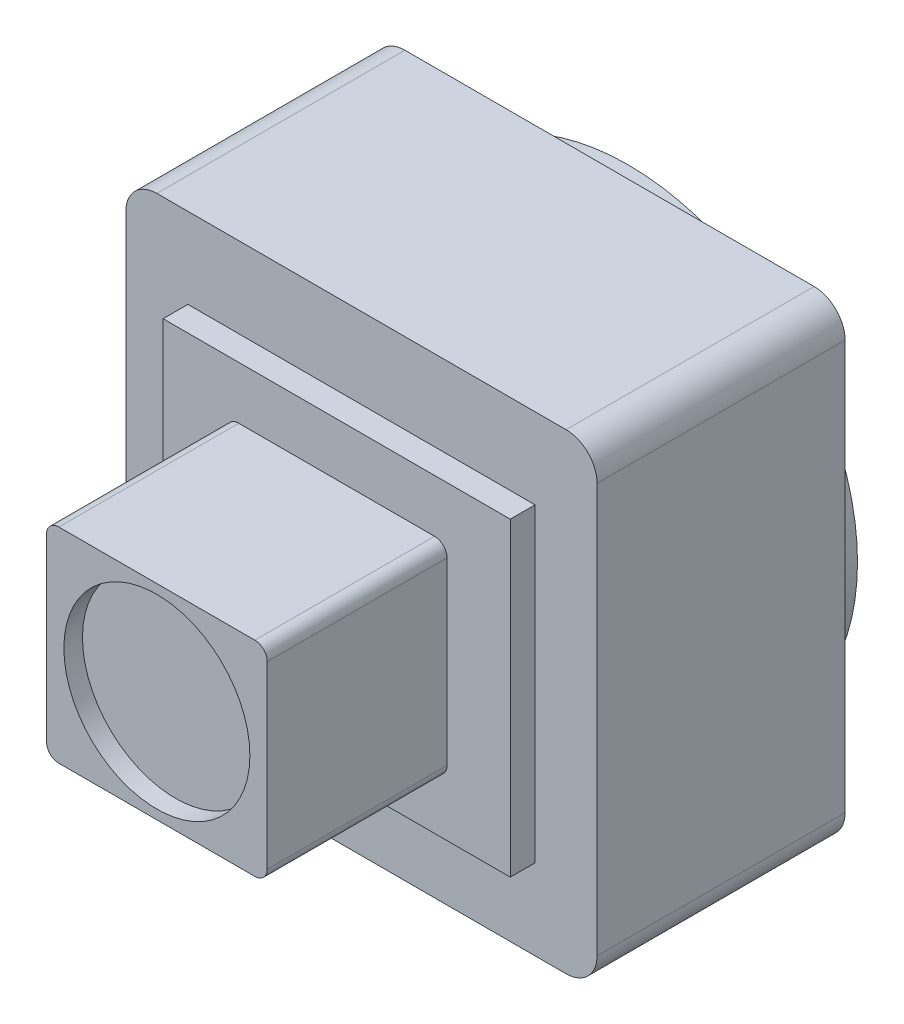
ISO-10303-21;
HEADER;
FILE_DESCRIPTION(('STEP AP214'),'2;1');
FILE_NAME('part.step','',(''),(''),'','','');
FILE_SCHEMA(('AUTOMOTIVE_DESIGN { 1 0 10303 214 1 1 1 1 }'));
ENDSEC;
DATA;
#1=APPLICATION_CONTEXT('core data for automotive mechanical design processes');
#2=APPLICATION_PROTOCOL_DEFINITION('international standard','automotive_design',2000,#1);
#3=PRODUCT_CONTEXT('',#1,'mechanical');
#4=PRODUCT('Part','Part','',(#3));
#5=PRODUCT_RELATED_PRODUCT_CATEGORY('part','',(#4));
#6=PRODUCT_DEFINITION_FORMATION('','',#4);
#7=PRODUCT_DEFINITION_CONTEXT('part definition',#1,'design');
#8=PRODUCT_DEFINITION('design','',#6,#7);
#9=PRODUCT_DEFINITION_SHAPE('','',#8);
#10=(LENGTH_UNIT() NAMED_UNIT(*) SI_UNIT(.MILLI.,.METRE.));
#11=(NAMED_UNIT(*) PLANE_ANGLE_UNIT() SI_UNIT($,.RADIAN.));
#12=(NAMED_UNIT(*) SI_UNIT($,.STERADIAN.) SOLID_ANGLE_UNIT());
#13=UNCERTAINTY_MEASURE_WITH_UNIT(LENGTH_MEASURE(1.E-05),#10,'distance_accuracy_value','');
#14=(GEOMETRIC_REPRESENTATION_CONTEXT(3) GLOBAL_UNCERTAINTY_ASSIGNED_CONTEXT((#13)) GLOBAL_UNIT_ASSIGNED_CONTEXT((#10,
#11,#12)) REPRESENTATION_CONTEXT('',''));
#15=CARTESIAN_POINT('',(0.,0.,0.));
#16=DIRECTION('',(0.,0.,1.));
#17=DIRECTION('',(1.,0.,0.));
#18=AXIS2_PLACEMENT_3D('',#15,#16,#17);
#19=CARTESIAN_POINT('',(48.26,48.26,50.8));
#20=DIRECTION('',(-1.,0.,0.));
#21=DIRECTION('',(0.,-1.,0.));
#22=AXIS2_PLACEMENT_3D('',#19,#20,#21);
#23=PLANE('',#22);
#24=DIRECTION('',(0.,1.,0.));
#25=VECTOR('',#24,1.);
#26=CARTESIAN_POINT('',(48.26,48.26,0.));
#27=LINE('',#26,#25);
#28=CARTESIAN_POINT('',(48.26,-41.91,0.));
#29=VERTEX_POINT('',#28);
#30=CARTESIAN_POINT('',(48.26,41.91,0.));
#31=VERTEX_POINT('',#30);
#32=EDGE_CURVE('E197',#29,#31,#27,.T.);
#33=ORIENTED_EDGE('',*,*,#32,.T.);
#34=DIRECTION('',(0.,0.,-1.));
#35=VECTOR('',#34,1.);
#36=CARTESIAN_POINT('',(48.26,41.91,50.8));
#37=LINE('',#36,#35);
#38=CARTESIAN_POINT('',(48.26,41.91,50.8));
#39=VERTEX_POINT('',#38);
#40=EDGE_CURVE('E276',#31,#39,#37,.F.);
#41=ORIENTED_EDGE('',*,*,#40,.T.);
#42=DIRECTION('',(0.,1.,0.));
#43=VECTOR('',#42,1.);
#44=CARTESIAN_POINT('',(48.26,48.26,50.8));
#45=LINE('',#44,#43);
#46=CARTESIAN_POINT('',(48.26,-41.91,50.8));
#47=VERTEX_POINT('',#46);
#48=EDGE_CURVE('E206',#47,#39,#45,.T.);
#49=ORIENTED_EDGE('',*,*,#48,.F.);
#50=DIRECTION('',(0.,0.,-1.));
#51=VECTOR('',#50,1.);
#52=CARTESIAN_POINT('',(48.26,-41.91,50.8));
#53=LINE('',#52,#51);
#54=EDGE_CURVE('E273',#47,#29,#53,.T.);
#55=ORIENTED_EDGE('',*,*,#54,.T.);
#56=EDGE_LOOP('',(#33,#41,#49,#55));
#57=FACE_BOUND('',#56,.T.);
#58=ADVANCED_FACE('F34',(#57),#23,.F.);
#59=CARTESIAN_POINT('',(-48.26,48.26,50.8));
#60=DIRECTION('',(0.,-1.,0.));
#61=DIRECTION('',(0.,0.,-1.));
#62=AXIS2_PLACEMENT_3D('',#59,#60,#61);
#63=PLANE('',#62);
#64=DIRECTION('',(-1.,0.,0.));
#65=VECTOR('',#64,1.);
#66=CARTESIAN_POINT('',(-48.26,48.26,50.8));
#67=LINE('',#66,#65);
#68=CARTESIAN_POINT('',(41.91,48.26,50.8));
#69=VERTEX_POINT('',#68);
#70=CARTESIAN_POINT('',(-41.91,48.26,50.8));
#71=VERTEX_POINT('',#70);
#72=EDGE_CURVE('E209',#69,#71,#67,.T.);
#73=ORIENTED_EDGE('',*,*,#72,.F.);
#74=DIRECTION('',(0.,0.,-1.));
#75=VECTOR('',#74,1.);
#76=CARTESIAN_POINT('',(41.91,48.26,50.8));
#77=LINE('',#76,#75);
#78=CARTESIAN_POINT('',(41.91,48.26,0.));
#79=VERTEX_POINT('',#78);
#80=EDGE_CURVE('E262',#69,#79,#77,.T.);
#81=ORIENTED_EDGE('',*,*,#80,.T.);
#82=DIRECTION('',(-1.,0.,0.));
#83=VECTOR('',#82,1.);
#84=CARTESIAN_POINT('',(-48.26,48.26,0.));
#85=LINE('',#84,#83);
#86=CARTESIAN_POINT('',(-41.91,48.26,0.));
#87=VERTEX_POINT('',#86);
#88=EDGE_CURVE('E200',#79,#87,#85,.T.);
#89=ORIENTED_EDGE('',*,*,#88,.T.);
#90=DIRECTION('',(0.,0.,-1.));
#91=VECTOR('',#90,1.);
#92=CARTESIAN_POINT('',(-41.91,48.26,50.8));
#93=LINE('',#92,#91);
#94=EDGE_CURVE('E260',#87,#71,#93,.F.);
#95=ORIENTED_EDGE('',*,*,#94,.T.);
#96=EDGE_LOOP('',(#73,#81,#89,#95));
#97=FACE_BOUND('',#96,.T.);
#98=ADVANCED_FACE('F320',(#97),#63,.F.);
#99=CARTESIAN_POINT('',(-48.26,48.26,50.8));
#100=DIRECTION('',(1.,0.,0.));
#101=DIRECTION('',(0.,1.,0.));
#102=AXIS2_PLACEMENT_3D('',#99,#100,#101);
#103=PLANE('',#102);
#104=DIRECTION('',(0.,-1.,0.));
#105=VECTOR('',#104,1.);
#106=CARTESIAN_POINT('',(-48.26,48.26,0.));
#107=LINE('',#106,#105);
#108=CARTESIAN_POINT('',(-48.26,41.91,0.));
#109=VERTEX_POINT('',#108);
#110=CARTESIAN_POINT('',(-48.26,-41.91,0.));
#111=VERTEX_POINT('',#110);
#112=EDGE_CURVE('E220',#109,#111,#107,.T.);
#113=ORIENTED_EDGE('',*,*,#112,.T.);
#114=DIRECTION('',(0.,0.,-1.));
#115=VECTOR('',#114,1.);
#116=CARTESIAN_POINT('',(-48.26,-41.91,50.8));
#117=LINE('',#116,#115);
#118=CARTESIAN_POINT('',(-48.26,-41.91,50.8));
#119=VERTEX_POINT('',#118);
#120=EDGE_CURVE('E11',#111,#119,#117,.F.);
#121=ORIENTED_EDGE('',*,*,#120,.T.);
#122=DIRECTION('',(0.,-1.,0.));
#123=VECTOR('',#122,1.);
#124=CARTESIAN_POINT('',(-48.26,48.26,50.8));
#125=LINE('',#124,#123);
#126=CARTESIAN_POINT('',(-48.26,41.91,50.8));
#127=VERTEX_POINT('',#126);
#128=EDGE_CURVE('E213',#127,#119,#125,.T.);
#129=ORIENTED_EDGE('',*,*,#128,.F.);
#130=DIRECTION('',(0.,0.,-1.));
#131=VECTOR('',#130,1.);
#132=CARTESIAN_POINT('',(-48.26,41.91,50.8));
#133=LINE('',#132,#131);
#134=EDGE_CURVE('E42',#127,#109,#133,.T.);
#135=ORIENTED_EDGE('',*,*,#134,.T.);
#136=EDGE_LOOP('',(#113,#121,#129,#135));
#137=FACE_BOUND('',#136,.T.);
#138=ADVANCED_FACE('F293',(#137),#103,.F.);
#139=CARTESIAN_POINT('',(-48.26,-48.26,50.8));
#140=DIRECTION('',(0.,1.,0.));
#141=DIRECTION('',(0.,0.,1.));
#142=AXIS2_PLACEMENT_3D('',#139,#140,#141);
#143=PLANE('',#142);
#144=DIRECTION('',(1.,0.,0.));
#145=VECTOR('',#144,1.);
#146=CARTESIAN_POINT('',(-48.26,-48.26,0.));
#147=LINE('',#146,#145);
#148=CARTESIAN_POINT('',(-41.91,-48.26,0.));
#149=VERTEX_POINT('',#148);
#150=CARTESIAN_POINT('',(41.91,-48.26,0.));
#151=VERTEX_POINT('',#150);
#152=EDGE_CURVE('E210',#149,#151,#147,.T.);
#153=ORIENTED_EDGE('',*,*,#152,.T.);
#154=DIRECTION('',(0.,0.,-1.));
#155=VECTOR('',#154,1.);
#156=CARTESIAN_POINT('',(41.91,-48.26,50.8));
#157=LINE('',#156,#155);
#158=CARTESIAN_POINT('',(41.91,-48.26,50.8));
#159=VERTEX_POINT('',#158);
#160=EDGE_CURVE('E49',#151,#159,#157,.F.);
#161=ORIENTED_EDGE('',*,*,#160,.T.);
#162=DIRECTION('',(1.,0.,0.));
#163=VECTOR('',#162,1.);
#164=CARTESIAN_POINT('',(-48.26,-48.26,50.8));
#165=LINE('',#164,#163);
#166=CARTESIAN_POINT('',(-41.91,-48.26,50.8));
#167=VERTEX_POINT('',#166);
#168=EDGE_CURVE('E215',#167,#159,#165,.T.);
#169=ORIENTED_EDGE('',*,*,#168,.F.);
#170=DIRECTION('',(0.,0.,-1.));
#171=VECTOR('',#170,1.);
#172=CARTESIAN_POINT('',(-41.91,-48.26,50.8));
#173=LINE('',#172,#171);
#174=EDGE_CURVE('E285',#167,#149,#173,.T.);
#175=ORIENTED_EDGE('',*,*,#174,.T.);
#176=EDGE_LOOP('',(#153,#161,#169,#175));
#177=FACE_BOUND('',#176,.T.);
#178=ADVANCED_FACE('F304',(#177),#143,.F.);
#179=CARTESIAN_POINT('',(0.,0.,50.8));
#180=DIRECTION('',(0.,0.,1.));
#181=DIRECTION('',(1.,0.,0.));
#182=AXIS2_PLACEMENT_3D('',#179,#180,#181);
#183=PLANE('',#182);
#184=DIRECTION('',(0.,1.,0.));
#185=VECTOR('',#184,1.);
#186=CARTESIAN_POINT('',(35.56,31.75,50.8));
#187=LINE('',#186,#185);
#188=CARTESIAN_POINT('',(35.56,-31.75,50.8));
#189=VERTEX_POINT('',#188);
#190=CARTESIAN_POINT('',(35.56,31.75,50.8));
#191=VERTEX_POINT('',#190);
#192=EDGE_CURVE('E196',#189,#191,#187,.T.);
#193=ORIENTED_EDGE('',*,*,#192,.F.);
#194=DIRECTION('',(1.,0.,0.));
#195=VECTOR('',#194,1.);
#196=CARTESIAN_POINT('',(-35.56,-31.75,50.8));
#197=LINE('',#196,#195);
#198=CARTESIAN_POINT('',(-35.56,-31.75,50.8));
#199=VERTEX_POINT('',#198);
#200=EDGE_CURVE('E193',#199,#189,#197,.T.);
#201=ORIENTED_EDGE('',*,*,#200,.F.);
#202=DIRECTION('',(0.,-1.,0.));
#203=VECTOR('',#202,1.);
#204=CARTESIAN_POINT('',(-35.56,31.75,50.8));
#205=LINE('',#204,#203);
#206=CARTESIAN_POINT('',(-35.56,31.75,50.8));
#207=VERTEX_POINT('',#206);
#208=EDGE_CURVE('E585',#207,#199,#205,.T.);
#209=ORIENTED_EDGE('',*,*,#208,.F.);
#210=DIRECTION('',(-1.,0.,0.));
#211=VECTOR('',#210,1.);
#212=CARTESIAN_POINT('',(-35.56,31.75,50.8));
#213=LINE('',#212,#211);
#214=EDGE_CURVE('E579',#191,#207,#213,.T.);
#215=ORIENTED_EDGE('',*,*,#214,.F.);
#216=EDGE_LOOP('',(#193,#201,#209,#215));
#217=FACE_BOUND('',#216,.T.);
#218=ORIENTED_EDGE('',*,*,#48,.T.);
#219=CARTESIAN_POINT('',(41.91,41.91,50.8));
#220=DIRECTION('',(0.,0.,1.));
#221=DIRECTION('',(1.,0.,0.));
#222=AXIS2_PLACEMENT_3D('',#219,#220,#221);
#223=CIRCLE('',#222,6.35);
#224=EDGE_CURVE('E283',#39,#69,#223,.T.);
#225=ORIENTED_EDGE('',*,*,#224,.T.);
#226=ORIENTED_EDGE('',*,*,#72,.T.);
#227=CARTESIAN_POINT('',(-41.91,41.91,50.8));
#228=DIRECTION('',(0.,0.,1.));
#229=DIRECTION('',(1.,0.,0.));
#230=AXIS2_PLACEMENT_3D('',#227,#228,#229);
#231=CIRCLE('',#230,6.35);
#232=EDGE_CURVE('E278',#71,#127,#231,.T.);
#233=ORIENTED_EDGE('',*,*,#232,.T.);
#234=ORIENTED_EDGE('',*,*,#128,.T.);
#235=CARTESIAN_POINT('',(-41.91,-41.91,50.8));
#236=DIRECTION('',(0.,0.,1.));
#237=DIRECTION('',(1.,0.,0.));
#238=AXIS2_PLACEMENT_3D('',#235,#236,#237);
#239=CIRCLE('',#238,6.35);
#240=EDGE_CURVE('E56',#119,#167,#239,.T.);
#241=ORIENTED_EDGE('',*,*,#240,.T.);
#242=ORIENTED_EDGE('',*,*,#168,.T.);
#243=CARTESIAN_POINT('',(41.91,-41.91,50.8));
#244=DIRECTION('',(0.,0.,1.));
#245=DIRECTION('',(1.,0.,0.));
#246=AXIS2_PLACEMENT_3D('',#243,#244,#245);
#247=CIRCLE('',#246,6.35);
#248=EDGE_CURVE('E281',#159,#47,#247,.T.);
#249=ORIENTED_EDGE('',*,*,#248,.T.);
#250=EDGE_LOOP('',(#218,#225,#226,#233,#234,#241,#242,#249));
#251=FACE_BOUND('',#250,.T.);
#252=ADVANCED_FACE('F306',(#217,#251),#183,.T.);
#253=CARTESIAN_POINT('',(0.,0.,0.));
#254=DIRECTION('',(0.,0.,1.));
#255=DIRECTION('',(1.,0.,0.));
#256=AXIS2_PLACEMENT_3D('',#253,#254,#255);
#257=PLANE('',#256);
#258=CARTESIAN_POINT('',(0.,0.,0.));
#259=DIRECTION('',(0.,0.,-1.));
#260=DIRECTION('',(-1.,0.,0.));
#261=AXIS2_PLACEMENT_3D('',#258,#259,#260);
#262=CIRCLE('',#261,46.99);
#263=CARTESIAN_POINT('',(46.99,0.,0.));
#264=VERTEX_POINT('',#263);
#265=EDGE_CURVE('E216',#264,#264,#262,.T.);
#266=ORIENTED_EDGE('',*,*,#265,.F.);
#267=EDGE_LOOP('',(#266));
#268=FACE_BOUND('',#267,.T.);
#269=ORIENTED_EDGE('',*,*,#88,.F.);
#270=CARTESIAN_POINT('',(41.91,41.91,0.));
#271=DIRECTION('',(0.,0.,1.));
#272=DIRECTION('',(1.,0.,0.));
#273=AXIS2_PLACEMENT_3D('',#270,#271,#272);
#274=CIRCLE('',#273,6.35);
#275=EDGE_CURVE('E271',#79,#31,#274,.F.);
#276=ORIENTED_EDGE('',*,*,#275,.T.);
#277=ORIENTED_EDGE('',*,*,#32,.F.);
#278=CARTESIAN_POINT('',(41.91,-41.91,0.));
#279=DIRECTION('',(0.,0.,1.));
#280=DIRECTION('',(1.,0.,0.));
#281=AXIS2_PLACEMENT_3D('',#278,#279,#280);
#282=CIRCLE('',#281,6.35);
#283=EDGE_CURVE('E269',#29,#151,#282,.F.);
#284=ORIENTED_EDGE('',*,*,#283,.T.);
#285=ORIENTED_EDGE('',*,*,#152,.F.);
#286=CARTESIAN_POINT('',(-41.91,-41.91,0.));
#287=DIRECTION('',(0.,0.,1.));
#288=DIRECTION('',(1.,0.,0.));
#289=AXIS2_PLACEMENT_3D('',#286,#287,#288);
#290=CIRCLE('',#289,6.35);
#291=EDGE_CURVE('E267',#149,#111,#290,.F.);
#292=ORIENTED_EDGE('',*,*,#291,.T.);
#293=ORIENTED_EDGE('',*,*,#112,.F.);
#294=CARTESIAN_POINT('',(-41.91,41.91,0.));
#295=DIRECTION('',(0.,0.,1.));
#296=DIRECTION('',(1.,0.,0.));
#297=AXIS2_PLACEMENT_3D('',#294,#295,#296);
#298=CIRCLE('',#297,6.35);
#299=EDGE_CURVE('E265',#109,#87,#298,.F.);
#300=ORIENTED_EDGE('',*,*,#299,.T.);
#301=EDGE_LOOP('',(#269,#276,#277,#284,#285,#292,#293,#300));
#302=FACE_BOUND('',#301,.T.);
#303=ADVANCED_FACE('F299',(#268,#302),#257,.F.);
#304=CARTESIAN_POINT('',(35.56,31.75,55.88));
#305=DIRECTION('',(-1.,0.,0.));
#306=DIRECTION('',(0.,0.,1.));
#307=AXIS2_PLACEMENT_3D('',#304,#305,#306);
#308=PLANE('',#307);
#309=ORIENTED_EDGE('',*,*,#192,.T.);
#310=DIRECTION('',(0.,0.,-1.));
#311=VECTOR('',#310,1.);
#312=CARTESIAN_POINT('',(35.56,31.75,55.88));
#313=LINE('',#312,#311);
#314=CARTESIAN_POINT('',(35.56,31.75,55.88));
#315=VERTEX_POINT('',#314);
#316=EDGE_CURVE('E177',#315,#191,#313,.T.);
#317=ORIENTED_EDGE('',*,*,#316,.F.);
#318=DIRECTION('',(0.,1.,0.));
#319=VECTOR('',#318,1.);
#320=CARTESIAN_POINT('',(35.56,31.75,55.88));
#321=LINE('',#320,#319);
#322=CARTESIAN_POINT('',(35.56,-31.75,55.88));
#323=VERTEX_POINT('',#322);
#324=EDGE_CURVE('E184',#323,#315,#321,.T.);
#325=ORIENTED_EDGE('',*,*,#324,.F.);
#326=DIRECTION('',(0.,0.,-1.));
#327=VECTOR('',#326,1.);
#328=CARTESIAN_POINT('',(35.56,-31.75,55.88));
#329=LINE('',#328,#327);
#330=EDGE_CURVE('E583',#323,#189,#329,.T.);
#331=ORIENTED_EDGE('',*,*,#330,.T.);
#332=EDGE_LOOP('',(#309,#317,#325,#331));
#333=FACE_BOUND('',#332,.T.);
#334=ADVANCED_FACE('F195',(#333),#308,.F.);
#335=CARTESIAN_POINT('',(-35.56,31.75,55.88));
#336=DIRECTION('',(0.,-1.,0.));
#337=DIRECTION('',(0.,0.,-1.));
#338=AXIS2_PLACEMENT_3D('',#335,#336,#337);
#339=PLANE('',#338);
#340=ORIENTED_EDGE('',*,*,#214,.T.);
#341=DIRECTION('',(0.,0.,-1.));
#342=VECTOR('',#341,1.);
#343=CARTESIAN_POINT('',(-35.56,31.75,55.88));
#344=LINE('',#343,#342);
#345=CARTESIAN_POINT('',(-35.56,31.75,55.88));
#346=VERTEX_POINT('',#345);
#347=EDGE_CURVE('E180',#346,#207,#344,.T.);
#348=ORIENTED_EDGE('',*,*,#347,.F.);
#349=DIRECTION('',(-1.,0.,0.));
#350=VECTOR('',#349,1.);
#351=CARTESIAN_POINT('',(-35.56,31.75,55.88));
#352=LINE('',#351,#350);
#353=EDGE_CURVE('E172',#315,#346,#352,.T.);
#354=ORIENTED_EDGE('',*,*,#353,.F.);
#355=ORIENTED_EDGE('',*,*,#316,.T.);
#356=EDGE_LOOP('',(#340,#348,#354,#355));
#357=FACE_BOUND('',#356,.T.);
#358=ADVANCED_FACE('F175',(#357),#339,.F.);
#359=CARTESIAN_POINT('',(-35.56,31.75,55.88));
#360=DIRECTION('',(1.,0.,0.));
#361=DIRECTION('',(0.,1.,0.));
#362=AXIS2_PLACEMENT_3D('',#359,#360,#361);
#363=PLANE('',#362);
#364=ORIENTED_EDGE('',*,*,#208,.T.);
#365=DIRECTION('',(0.,0.,-1.));
#366=VECTOR('',#365,1.);
#367=CARTESIAN_POINT('',(-35.56,-31.75,55.88));
#368=LINE('',#367,#366);
#369=CARTESIAN_POINT('',(-35.56,-31.75,55.88));
#370=VERTEX_POINT('',#369);
#371=EDGE_CURVE('E202',#370,#199,#368,.T.);
#372=ORIENTED_EDGE('',*,*,#371,.F.);
#373=DIRECTION('',(0.,-1.,0.));
#374=VECTOR('',#373,1.);
#375=CARTESIAN_POINT('',(-35.56,31.75,55.88));
#376=LINE('',#375,#374);
#377=EDGE_CURVE('E183',#346,#370,#376,.T.);
#378=ORIENTED_EDGE('',*,*,#377,.F.);
#379=ORIENTED_EDGE('',*,*,#347,.T.);
#380=EDGE_LOOP('',(#364,#372,#378,#379));
#381=FACE_BOUND('',#380,.T.);
#382=ADVANCED_FACE('F492',(#381),#363,.F.);
#383=CARTESIAN_POINT('',(-35.56,-31.75,55.88));
#384=DIRECTION('',(0.,1.,0.));
#385=DIRECTION('',(0.,0.,1.));
#386=AXIS2_PLACEMENT_3D('',#383,#384,#385);
#387=PLANE('',#386);
#388=ORIENTED_EDGE('',*,*,#200,.T.);
#389=ORIENTED_EDGE('',*,*,#330,.F.);
#390=DIRECTION('',(1.,0.,0.));
#391=VECTOR('',#390,1.);
#392=CARTESIAN_POINT('',(-35.56,-31.75,55.88));
#393=LINE('',#392,#391);
#394=EDGE_CURVE('E189',#370,#323,#393,.T.);
#395=ORIENTED_EDGE('',*,*,#394,.F.);
#396=ORIENTED_EDGE('',*,*,#371,.T.);
#397=EDGE_LOOP('',(#388,#389,#395,#396));
#398=FACE_BOUND('',#397,.T.);
#399=ADVANCED_FACE('F484',(#398),#387,.F.);
#400=CARTESIAN_POINT('',(0.,0.,55.88));
#401=DIRECTION('',(0.,0.,1.));
#402=DIRECTION('',(1.,0.,0.));
#403=AXIS2_PLACEMENT_3D('',#400,#401,#402);
#404=PLANE('',#403);
#405=DIRECTION('',(0.,1.,0.));
#406=VECTOR('',#405,1.);
#407=CARTESIAN_POINT('',(22.606,20.955,55.88));
#408=LINE('',#407,#406);
#409=CARTESIAN_POINT('',(22.606,-18.415,55.88));
#410=VERTEX_POINT('',#409);
#411=CARTESIAN_POINT('',(22.606,18.415,55.88));
#412=VERTEX_POINT('',#411);
#413=EDGE_CURVE('E603',#410,#412,#408,.T.);
#414=ORIENTED_EDGE('',*,*,#413,.F.);
#415=CARTESIAN_POINT('',(20.066,-18.415,55.88));
#416=DIRECTION('',(0.,0.,1.));
#417=DIRECTION('',(1.,0.,0.));
#418=AXIS2_PLACEMENT_3D('',#415,#416,#417);
#419=CIRCLE('',#418,2.54);
#420=CARTESIAN_POINT('',(20.066,-20.955,55.88));
#421=VERTEX_POINT('',#420);
#422=EDGE_CURVE('E256',#410,#421,#419,.F.);
#423=ORIENTED_EDGE('',*,*,#422,.T.);
#424=DIRECTION('',(1.,0.,0.));
#425=VECTOR('',#424,1.);
#426=CARTESIAN_POINT('',(-22.606,-20.955,55.88));
#427=LINE('',#426,#425);
#428=CARTESIAN_POINT('',(-20.066,-20.955,55.88));
#429=VERTEX_POINT('',#428);
#430=EDGE_CURVE('E593',#429,#421,#427,.T.);
#431=ORIENTED_EDGE('',*,*,#430,.F.);
#432=CARTESIAN_POINT('',(-20.066,-18.415,55.88));
#433=DIRECTION('',(0.,0.,1.));
#434=DIRECTION('',(1.,0.,0.));
#435=AXIS2_PLACEMENT_3D('',#432,#433,#434);
#436=CIRCLE('',#435,2.54);
#437=CARTESIAN_POINT('',(-22.606,-18.415,55.88));
#438=VERTEX_POINT('',#437);
#439=EDGE_CURVE('E252',#429,#438,#436,.F.);
#440=ORIENTED_EDGE('',*,*,#439,.T.);
#441=DIRECTION('',(0.,-1.,0.));
#442=VECTOR('',#441,1.);
#443=CARTESIAN_POINT('',(-22.606,20.955,55.88));
#444=LINE('',#443,#442);
#445=CARTESIAN_POINT('',(-22.606,18.415,55.88));
#446=VERTEX_POINT('',#445);
#447=EDGE_CURVE('E597',#446,#438,#444,.T.);
#448=ORIENTED_EDGE('',*,*,#447,.F.);
#449=CARTESIAN_POINT('',(-20.066,18.415,55.88));
#450=DIRECTION('',(0.,0.,1.));
#451=DIRECTION('',(1.,0.,0.));
#452=AXIS2_PLACEMENT_3D('',#449,#450,#451);
#453=CIRCLE('',#452,2.54);
#454=CARTESIAN_POINT('',(-20.066,20.955,55.88));
#455=VERTEX_POINT('',#454);
#456=EDGE_CURVE('E254',#446,#455,#453,.F.);
#457=ORIENTED_EDGE('',*,*,#456,.T.);
#458=DIRECTION('',(-1.,0.,0.));
#459=VECTOR('',#458,1.);
#460=CARTESIAN_POINT('',(-22.606,20.955,55.88));
#461=LINE('',#460,#459);
#462=CARTESIAN_POINT('',(20.066,20.955,55.88));
#463=VERTEX_POINT('',#462);
#464=EDGE_CURVE('E600',#463,#455,#461,.T.);
#465=ORIENTED_EDGE('',*,*,#464,.F.);
#466=CARTESIAN_POINT('',(20.066,18.415,55.88));
#467=DIRECTION('',(0.,0.,1.));
#468=DIRECTION('',(1.,0.,0.));
#469=AXIS2_PLACEMENT_3D('',#466,#467,#468);
#470=CIRCLE('',#469,2.54);
#471=EDGE_CURVE('E258',#463,#412,#470,.F.);
#472=ORIENTED_EDGE('',*,*,#471,.T.);
#473=EDGE_LOOP('',(#414,#423,#431,#440,#448,#457,#465,#472));
#474=FACE_BOUND('',#473,.T.);
#475=ORIENTED_EDGE('',*,*,#324,.T.);
#476=ORIENTED_EDGE('',*,*,#353,.T.);
#477=ORIENTED_EDGE('',*,*,#377,.T.);
#478=ORIENTED_EDGE('',*,*,#394,.T.);
#479=EDGE_LOOP('',(#475,#476,#477,#478));
#480=FACE_BOUND('',#479,.T.);
#481=ADVANCED_FACE('F187',(#474,#480),#404,.T.);
#482=CARTESIAN_POINT('',(22.606,20.955,92.71));
#483=DIRECTION('',(-1.,0.,0.));
#484=DIRECTION('',(0.,0.,1.));
#485=AXIS2_PLACEMENT_3D('',#482,#483,#484);
#486=PLANE('',#485);
#487=DIRECTION('',(0.,1.,0.));
#488=VECTOR('',#487,1.);
#489=CARTESIAN_POINT('',(22.606,20.955,92.71));
#490=LINE('',#489,#488);
#491=CARTESIAN_POINT('',(22.606,-18.415,92.71));
#492=VERTEX_POINT('',#491);
#493=CARTESIAN_POINT('',(22.606,18.415,92.71));
#494=VERTEX_POINT('',#493);
#495=EDGE_CURVE('E596',#492,#494,#490,.T.);
#496=ORIENTED_EDGE('',*,*,#495,.F.);
#497=DIRECTION('',(0.,0.,-1.));
#498=VECTOR('',#497,1.);
#499=CARTESIAN_POINT('',(22.606,-18.415,92.71));
#500=LINE('',#499,#498);
#501=EDGE_CURVE('E249',#492,#410,#500,.T.);
#502=ORIENTED_EDGE('',*,*,#501,.T.);
#503=ORIENTED_EDGE('',*,*,#413,.T.);
#504=DIRECTION('',(0.,0.,-1.));
#505=VECTOR('',#504,1.);
#506=CARTESIAN_POINT('',(22.606,18.415,92.71));
#507=LINE('',#506,#505);
#508=EDGE_CURVE('E247',#412,#494,#507,.F.);
#509=ORIENTED_EDGE('',*,*,#508,.T.);
#510=EDGE_LOOP('',(#496,#502,#503,#509));
#511=FACE_BOUND('',#510,.T.);
#512=ADVANCED_FACE('F468',(#511),#486,.F.);
#513=CARTESIAN_POINT('',(-22.606,20.955,92.71));
#514=DIRECTION('',(0.,-1.,0.));
#515=DIRECTION('',(0.,0.,-1.));
#516=AXIS2_PLACEMENT_3D('',#513,#514,#515);
#517=PLANE('',#516);
#518=ORIENTED_EDGE('',*,*,#464,.T.);
#519=DIRECTION('',(0.,0.,-1.));
#520=VECTOR('',#519,1.);
#521=CARTESIAN_POINT('',(-20.066,20.955,92.71));
#522=LINE('',#521,#520);
#523=CARTESIAN_POINT('',(-20.066,20.955,92.71));
#524=VERTEX_POINT('',#523);
#525=EDGE_CURVE('E245',#455,#524,#522,.F.);
#526=ORIENTED_EDGE('',*,*,#525,.T.);
#527=DIRECTION('',(-1.,0.,0.));
#528=VECTOR('',#527,1.);
#529=CARTESIAN_POINT('',(-22.606,20.955,92.71));
#530=LINE('',#529,#528);
#531=CARTESIAN_POINT('',(20.066,20.955,92.71));
#532=VERTEX_POINT('',#531);
#533=EDGE_CURVE('E612',#532,#524,#530,.T.);
#534=ORIENTED_EDGE('',*,*,#533,.F.);
#535=DIRECTION('',(0.,0.,-1.));
#536=VECTOR('',#535,1.);
#537=CARTESIAN_POINT('',(20.066,20.955,92.71));
#538=LINE('',#537,#536);
#539=EDGE_CURVE('E242',#532,#463,#538,.T.);
#540=ORIENTED_EDGE('',*,*,#539,.T.);
#541=EDGE_LOOP('',(#518,#526,#534,#540));
#542=FACE_BOUND('',#541,.T.);
#543=ADVANCED_FACE('F459',(#542),#517,.F.);
#544=CARTESIAN_POINT('',(-22.606,20.955,92.71));
#545=DIRECTION('',(1.,0.,0.));
#546=DIRECTION('',(0.,1.,0.));
#547=AXIS2_PLACEMENT_3D('',#544,#545,#546);
#548=PLANE('',#547);
#549=ORIENTED_EDGE('',*,*,#447,.T.);
#550=DIRECTION('',(0.,0.,-1.));
#551=VECTOR('',#550,1.);
#552=CARTESIAN_POINT('',(-22.606,-18.415,92.71));
#553=LINE('',#552,#551);
#554=CARTESIAN_POINT('',(-22.606,-18.415,92.71));
#555=VERTEX_POINT('',#554);
#556=EDGE_CURVE('E232',#438,#555,#553,.F.);
#557=ORIENTED_EDGE('',*,*,#556,.T.);
#558=DIRECTION('',(0.,-1.,0.));
#559=VECTOR('',#558,1.);
#560=CARTESIAN_POINT('',(-22.606,20.955,92.71));
#561=LINE('',#560,#559);
#562=CARTESIAN_POINT('',(-22.606,18.415,92.71));
#563=VERTEX_POINT('',#562);
#564=EDGE_CURVE('E609',#563,#555,#561,.T.);
#565=ORIENTED_EDGE('',*,*,#564,.F.);
#566=DIRECTION('',(0.,0.,-1.));
#567=VECTOR('',#566,1.);
#568=CARTESIAN_POINT('',(-22.606,18.415,92.71));
#569=LINE('',#568,#567);
#570=EDGE_CURVE('E229',#563,#446,#569,.T.);
#571=ORIENTED_EDGE('',*,*,#570,.T.);
#572=EDGE_LOOP('',(#549,#557,#565,#571));
#573=FACE_BOUND('',#572,.T.);
#574=ADVANCED_FACE('F450',(#573),#548,.F.);
#575=CARTESIAN_POINT('',(-22.606,-20.955,92.71));
#576=DIRECTION('',(0.,1.,0.));
#577=DIRECTION('',(0.,0.,1.));
#578=AXIS2_PLACEMENT_3D('',#575,#576,#577);
#579=PLANE('',#578);
#580=DIRECTION('',(1.,0.,0.));
#581=VECTOR('',#580,1.);
#582=CARTESIAN_POINT('',(-22.606,-20.955,92.71));
#583=LINE('',#582,#581);
#584=CARTESIAN_POINT('',(-20.066,-20.955,92.71));
#585=VERTEX_POINT('',#584);
#586=CARTESIAN_POINT('',(20.066,-20.955,92.71));
#587=VERTEX_POINT('',#586);
#588=EDGE_CURVE('E580',#585,#587,#583,.T.);
#589=ORIENTED_EDGE('',*,*,#588,.F.);
#590=DIRECTION('',(0.,0.,-1.));
#591=VECTOR('',#590,1.);
#592=CARTESIAN_POINT('',(-20.066,-20.955,92.71));
#593=LINE('',#592,#591);
#594=EDGE_CURVE('E226',#585,#429,#593,.T.);
#595=ORIENTED_EDGE('',*,*,#594,.T.);
#596=ORIENTED_EDGE('',*,*,#430,.T.);
#597=DIRECTION('',(0.,0.,-1.));
#598=VECTOR('',#597,1.);
#599=CARTESIAN_POINT('',(20.066,-20.955,92.71));
#600=LINE('',#599,#598);
#601=EDGE_CURVE('E224',#421,#587,#600,.F.);
#602=ORIENTED_EDGE('',*,*,#601,.T.);
#603=EDGE_LOOP('',(#589,#595,#596,#602));
#604=FACE_BOUND('',#603,.T.);
#605=ADVANCED_FACE('F441',(#604),#579,.F.);
#606=CARTESIAN_POINT('',(0.,0.,92.71));
#607=DIRECTION('',(0.,0.,1.));
#608=DIRECTION('',(1.,0.,0.));
#609=AXIS2_PLACEMENT_3D('',#606,#607,#608);
#610=PLANE('',#609);
#611=CARTESIAN_POINT('',(0.,0.,92.71));
#612=DIRECTION('',(0.,0.,1.));
#613=DIRECTION('',(1.,0.,0.));
#614=AXIS2_PLACEMENT_3D('',#611,#612,#613);
#615=CIRCLE('',#614,19.05);
#616=CARTESIAN_POINT('',(19.05,0.,92.71));
#617=VERTEX_POINT('',#616);
#618=EDGE_CURVE('E617',#617,#617,#615,.T.);
#619=ORIENTED_EDGE('',*,*,#618,.F.);
#620=EDGE_LOOP('',(#619));
#621=FACE_BOUND('',#620,.T.);
#622=ORIENTED_EDGE('',*,*,#564,.T.);
#623=CARTESIAN_POINT('',(-20.066,-18.415,92.71));
#624=DIRECTION('',(0.,0.,1.));
#625=DIRECTION('',(1.,0.,0.));
#626=AXIS2_PLACEMENT_3D('',#623,#624,#625);
#627=CIRCLE('',#626,2.54);
#628=EDGE_CURVE('E240',#555,#585,#627,.T.);
#629=ORIENTED_EDGE('',*,*,#628,.T.);
#630=ORIENTED_EDGE('',*,*,#588,.T.);
#631=CARTESIAN_POINT('',(20.066,-18.415,92.71));
#632=DIRECTION('',(0.,0.,1.));
#633=DIRECTION('',(1.,0.,0.));
#634=AXIS2_PLACEMENT_3D('',#631,#632,#633);
#635=CIRCLE('',#634,2.54);
#636=EDGE_CURVE('E236',#587,#492,#635,.T.);
#637=ORIENTED_EDGE('',*,*,#636,.T.);
#638=ORIENTED_EDGE('',*,*,#495,.T.);
#639=CARTESIAN_POINT('',(20.066,18.415,92.71));
#640=DIRECTION('',(0.,0.,1.));
#641=DIRECTION('',(1.,0.,0.));
#642=AXIS2_PLACEMENT_3D('',#639,#640,#641);
#643=CIRCLE('',#642,2.54);
#644=EDGE_CURVE('E234',#494,#532,#643,.T.);
#645=ORIENTED_EDGE('',*,*,#644,.T.);
#646=ORIENTED_EDGE('',*,*,#533,.T.);
#647=CARTESIAN_POINT('',(-20.066,18.415,92.71));
#648=DIRECTION('',(0.,0.,1.));
#649=DIRECTION('',(1.,0.,0.));
#650=AXIS2_PLACEMENT_3D('',#647,#648,#649);
#651=CIRCLE('',#650,2.54);
#652=EDGE_CURVE('E238',#524,#563,#651,.T.);
#653=ORIENTED_EDGE('',*,*,#652,.T.);
#654=EDGE_LOOP('',(#622,#629,#630,#637,#638,#645,#646,#653));
#655=FACE_BOUND('',#654,.T.);
#656=ADVANCED_FACE('F432',(#621,#655),#610,.T.);
#657=CARTESIAN_POINT('',(0.,0.,88.9));
#658=DIRECTION('',(0.,0.,1.));
#659=DIRECTION('',(1.,0.,0.));
#660=AXIS2_PLACEMENT_3D('',#657,#658,#659);
#661=CYLINDRICAL_SURFACE('',#660,19.05);
#662=CARTESIAN_POINT('',(0.,0.,88.9));
#663=DIRECTION('',(0.,0.,1.));
#664=DIRECTION('',(1.,0.,0.));
#665=AXIS2_PLACEMENT_3D('',#662,#663,#664);
#666=CIRCLE('',#665,19.05);
#667=CARTESIAN_POINT('',(19.05,0.,88.9));
#668=VERTEX_POINT('',#667);
#669=EDGE_CURVE('E606',#668,#668,#666,.T.);
#670=CARTESIAN_POINT('',(19.05,0.,88.9));
#671=CARTESIAN_POINT('',(19.05,0.,88.9396875));
#672=CARTESIAN_POINT('',(19.05,0.,88.979375));
#673=CARTESIAN_POINT('',(19.05,0.,89.05875));
#674=CARTESIAN_POINT('',(19.05,0.,89.0984375));
#675=CARTESIAN_POINT('',(19.05,0.,89.1778125));
#676=CARTESIAN_POINT('',(19.05,0.,89.2175));
#677=CARTESIAN_POINT('',(19.05,0.,89.296875));
#678=CARTESIAN_POINT('',(19.05,0.,89.3365625));
#679=CARTESIAN_POINT('',(19.05,0.,89.4159375));
#680=CARTESIAN_POINT('',(19.05,0.,89.455625));
#681=CARTESIAN_POINT('',(19.05,0.,89.535));
#682=CARTESIAN_POINT('',(19.05,0.,89.5746875));
#683=CARTESIAN_POINT('',(19.05,0.,89.6540625));
#684=CARTESIAN_POINT('',(19.05,0.,89.69375));
#685=CARTESIAN_POINT('',(19.05,0.,89.773125));
#686=CARTESIAN_POINT('',(19.05,0.,89.8128125));
#687=CARTESIAN_POINT('',(19.05,0.,89.8921875));
#688=CARTESIAN_POINT('',(19.05,0.,89.931875));
#689=CARTESIAN_POINT('',(19.05,0.,90.01125));
#690=CARTESIAN_POINT('',(19.05,0.,90.0509375));
#691=CARTESIAN_POINT('',(19.05,0.,90.1303125));
#692=CARTESIAN_POINT('',(19.05,0.,90.17));
#693=CARTESIAN_POINT('',(19.05,0.,90.249375));
#694=CARTESIAN_POINT('',(19.05,0.,90.2890625));
#695=CARTESIAN_POINT('',(19.05,0.,90.3684375));
#696=CARTESIAN_POINT('',(19.05,0.,90.408125));
#697=CARTESIAN_POINT('',(19.05,0.,90.4875));
#698=CARTESIAN_POINT('',(19.05,0.,90.5271875));
#699=CARTESIAN_POINT('',(19.05,0.,90.6065625));
#700=CARTESIAN_POINT('',(19.05,0.,90.64625));
#701=CARTESIAN_POINT('',(19.05,0.,90.725625));
#702=CARTESIAN_POINT('',(19.05,0.,90.7653125));
#703=CARTESIAN_POINT('',(19.05,0.,90.8446875));
#704=CARTESIAN_POINT('',(19.05,0.,90.884375));
#705=CARTESIAN_POINT('',(19.05,0.,90.96375));
#706=CARTESIAN_POINT('',(19.05,0.,91.0034375));
#707=CARTESIAN_POINT('',(19.05,0.,91.0828125));
#708=CARTESIAN_POINT('',(19.05,0.,91.1225));
#709=CARTESIAN_POINT('',(19.05,0.,91.201875));
#710=CARTESIAN_POINT('',(19.05,0.,91.2415625));
#711=CARTESIAN_POINT('',(19.05,0.,91.3209375));
#712=CARTESIAN_POINT('',(19.05,0.,91.360625));
#713=CARTESIAN_POINT('',(19.05,0.,91.44));
#714=CARTESIAN_POINT('',(19.05,0.,91.4796875));
#715=CARTESIAN_POINT('',(19.05,0.,91.5590625));
#716=CARTESIAN_POINT('',(19.05,0.,91.59875));
#717=CARTESIAN_POINT('',(19.05,0.,91.678125));
#718=CARTESIAN_POINT('',(19.05,0.,91.7178125));
#719=CARTESIAN_POINT('',(19.05,0.,91.7971875));
#720=CARTESIAN_POINT('',(19.05,0.,91.836875));
#721=CARTESIAN_POINT('',(19.05,0.,91.91625));
#722=CARTESIAN_POINT('',(19.05,0.,91.9559375));
#723=CARTESIAN_POINT('',(19.05,0.,92.0353125));
#724=CARTESIAN_POINT('',(19.05,0.,92.075));
#725=CARTESIAN_POINT('',(19.05,0.,92.154375));
#726=CARTESIAN_POINT('',(19.05,0.,92.1940625));
#727=CARTESIAN_POINT('',(19.05,0.,92.2734375));
#728=CARTESIAN_POINT('',(19.05,0.,92.313125));
#729=CARTESIAN_POINT('',(19.05,0.,92.3925));
#730=CARTESIAN_POINT('',(19.05,0.,92.4321875));
#731=CARTESIAN_POINT('',(19.05,0.,92.5115625));
#732=CARTESIAN_POINT('',(19.05,0.,92.55125));
#733=CARTESIAN_POINT('',(19.05,0.,92.630625));
#734=CARTESIAN_POINT('',(19.05,0.,92.6703125));
#735=CARTESIAN_POINT('',(19.05,0.,92.71));
#736=B_SPLINE_CURVE_WITH_KNOTS('',3,(#670,#671,#672,#673,#674,#675,#676,#677,#678,#679,#680,
#681,#682,#683,#684,#685,#686,#687,#688,#689,#690,#691,#692,#693,#694,#695,#696,#697,#698,#699,
#700,#701,#702,#703,#704,#705,#706,#707,#708,#709,#710,#711,#712,#713,#714,#715,#716,#717,#718,
#719,#720,#721,#722,#723,#724,#725,#726,#727,#728,#729,#730,#731,#732,#733,#734,#735),
.UNSPECIFIED.,.F.,.F.,(4,2,2,2,2,2,2,2,2,2,2,2,2,2,2,2,2,2,2,2,2,2,2,2,2,2,2,2,2,2,2,2,4),(0.,
0.119062499999989,0.238124999999992,0.357187499999995,0.476249999999998,0.595312499999986,
0.714374999999989,0.833437499999992,0.952499999999995,1.0715625,1.19062499999999,
1.30968749999999,1.42874999999999,1.5478125,1.66687499999998,1.78593749999999,1.90499999999999,
2.02406249999999,2.143125,2.26218749999998,2.38124999999999,2.50031249999999,2.61937499999999,
2.73843749999998,2.85749999999998,2.97656249999999,3.09562499999999,3.21468749999999,
3.33374999999998,3.45281249999999,3.57187499999999,3.69093749999999,3.80999999999998),.UNSPECIFIED.);
#737=EDGE_CURVE('BSEAM423',#668,#617,#736,.T.);
#738=ORIENTED_EDGE('',*,*,#669,.F.);
#739=ORIENTED_EDGE('',*,*,#618,.T.);
#740=ORIENTED_EDGE('',*,*,#737,.T.);
#741=ORIENTED_EDGE('',*,*,#737,.F.);
#742=EDGE_LOOP('',(#738,#740,#739,#741));
#743=FACE_BOUND('',#742,.T.);
#744=ADVANCED_FACE('F423',(#743),#661,.F.);
#745=CARTESIAN_POINT('',(0.,0.,88.9));
#746=DIRECTION('',(0.,0.,1.));
#747=DIRECTION('',(1.,0.,0.));
#748=AXIS2_PLACEMENT_3D('',#745,#746,#747);
#749=PLANE('',#748);
#750=ORIENTED_EDGE('',*,*,#669,.T.);
#751=EDGE_LOOP('',(#750));
#752=FACE_BOUND('',#751,.T.);
#753=ADVANCED_FACE('F414',(#752),#749,.T.);
#754=CARTESIAN_POINT('',(0.,0.,-3.81));
#755=DIRECTION('',(0.,0.,1.));
#756=DIRECTION('',(1.,0.,0.));
#757=AXIS2_PLACEMENT_3D('',#754,#755,#756);
#758=CYLINDRICAL_SURFACE('',#757,46.99);
#759=CARTESIAN_POINT('',(0.,0.,-3.81));
#760=DIRECTION('',(0.,0.,-1.));
#761=DIRECTION('',(-1.,0.,0.));
#762=AXIS2_PLACEMENT_3D('',#759,#760,#761);
#763=CIRCLE('',#762,46.99);
#764=CARTESIAN_POINT('',(46.99,0.,-3.81));
#765=VERTEX_POINT('',#764);
#766=EDGE_CURVE('E620',#765,#765,#763,.T.);
#767=CARTESIAN_POINT('',(46.99,0.,-3.81));
#768=CARTESIAN_POINT('',(46.99,0.,-3.7703125));
#769=CARTESIAN_POINT('',(46.99,0.,-3.730625));
#770=CARTESIAN_POINT('',(46.99,0.,-3.65125));
#771=CARTESIAN_POINT('',(46.99,0.,-3.6115625));
#772=CARTESIAN_POINT('',(46.99,0.,-3.5321875));
#773=CARTESIAN_POINT('',(46.99,0.,-3.4925));
#774=CARTESIAN_POINT('',(46.99,0.,-3.413125));
#775=CARTESIAN_POINT('',(46.99,0.,-3.3734375));
#776=CARTESIAN_POINT('',(46.99,0.,-3.2940625));
#777=CARTESIAN_POINT('',(46.99,0.,-3.254375));
#778=CARTESIAN_POINT('',(46.99,0.,-3.175));
#779=CARTESIAN_POINT('',(46.99,0.,-3.1353125));
#780=CARTESIAN_POINT('',(46.99,0.,-3.0559375));
#781=CARTESIAN_POINT('',(46.99,0.,-3.01625));
#782=CARTESIAN_POINT('',(46.99,0.,-2.936875));
#783=CARTESIAN_POINT('',(46.99,0.,-2.8971875));
#784=CARTESIAN_POINT('',(46.99,0.,-2.8178125));
#785=CARTESIAN_POINT('',(46.99,0.,-2.778125));
#786=CARTESIAN_POINT('',(46.99,0.,-2.69875));
#787=CARTESIAN_POINT('',(46.99,0.,-2.6590625));
#788=CARTESIAN_POINT('',(46.99,0.,-2.5796875));
#789=CARTESIAN_POINT('',(46.99,0.,-2.54));
#790=CARTESIAN_POINT('',(46.99,0.,-2.460625));
#791=CARTESIAN_POINT('',(46.99,0.,-2.4209375));
#792=CARTESIAN_POINT('',(46.99,0.,-2.3415625));
#793=CARTESIAN_POINT('',(46.99,0.,-2.301875));
#794=CARTESIAN_POINT('',(46.99,0.,-2.2225));
#795=CARTESIAN_POINT('',(46.99,0.,-2.1828125));
#796=CARTESIAN_POINT('',(46.99,0.,-2.1034375));
#797=CARTESIAN_POINT('',(46.99,0.,-2.06375));
#798=CARTESIAN_POINT('',(46.99,0.,-1.984375));
#799=CARTESIAN_POINT('',(46.99,0.,-1.9446875));
#800=CARTESIAN_POINT('',(46.99,0.,-1.8653125));
#801=CARTESIAN_POINT('',(46.99,0.,-1.825625));
#802=CARTESIAN_POINT('',(46.99,0.,-1.74625));
#803=CARTESIAN_POINT('',(46.99,0.,-1.7065625));
#804=CARTESIAN_POINT('',(46.99,0.,-1.6271875));
#805=CARTESIAN_POINT('',(46.99,0.,-1.5875));
#806=CARTESIAN_POINT('',(46.99,0.,-1.508125));
#807=CARTESIAN_POINT('',(46.99,0.,-1.4684375));
#808=CARTESIAN_POINT('',(46.99,0.,-1.3890625));
#809=CARTESIAN_POINT('',(46.99,0.,-1.349375));
#810=CARTESIAN_POINT('',(46.99,0.,-1.27));
#811=CARTESIAN_POINT('',(46.99,0.,-1.2303125));
#812=CARTESIAN_POINT('',(46.99,0.,-1.1509375));
#813=CARTESIAN_POINT('',(46.99,0.,-1.11125));
#814=CARTESIAN_POINT('',(46.99,0.,-1.031875));
#815=CARTESIAN_POINT('',(46.99,0.,-0.9921875));
#816=CARTESIAN_POINT('',(46.99,0.,-0.9128125));
#817=CARTESIAN_POINT('',(46.99,0.,-0.873125));
#818=CARTESIAN_POINT('',(46.99,0.,-0.79375));
#819=CARTESIAN_POINT('',(46.99,0.,-0.7540625));
#820=CARTESIAN_POINT('',(46.99,0.,-0.6746875));
#821=CARTESIAN_POINT('',(46.99,0.,-0.635));
#822=CARTESIAN_POINT('',(46.99,0.,-0.555625));
#823=CARTESIAN_POINT('',(46.99,0.,-0.5159375));
#824=CARTESIAN_POINT('',(46.99,0.,-0.4365625));
#825=CARTESIAN_POINT('',(46.99,0.,-0.396875));
#826=CARTESIAN_POINT('',(46.99,0.,-0.3175));
#827=CARTESIAN_POINT('',(46.99,0.,-0.2778125));
#828=CARTESIAN_POINT('',(46.99,0.,-0.1984375));
#829=CARTESIAN_POINT('',(46.99,0.,-0.15875));
#830=CARTESIAN_POINT('',(46.99,0.,-0.0793749999999999));
#831=CARTESIAN_POINT('',(46.99,0.,-0.0396874999999999));
#832=CARTESIAN_POINT('',(46.99,0.,0.));
#833=B_SPLINE_CURVE_WITH_KNOTS('',3,(#767,#768,#769,#770,#771,#772,#773,#774,#775,#776,#777,
#778,#779,#780,#781,#782,#783,#784,#785,#786,#787,#788,#789,#790,#791,#792,#793,#794,#795,#796,
#797,#798,#799,#800,#801,#802,#803,#804,#805,#806,#807,#808,#809,#810,#811,#812,#813,#814,#815,
#816,#817,#818,#819,#820,#821,#822,#823,#824,#825,#826,#827,#828,#829,#830,#831,#832),
.UNSPECIFIED.,.F.,.F.,(4,2,2,2,2,2,2,2,2,2,2,2,2,2,2,2,2,2,2,2,2,2,2,2,2,2,2,2,2,2,2,2,4),(0.,
0.1190625,0.238125,0.3571875,0.47625,0.595312499999999,0.714375,0.833437499999999,
0.952499999999999,1.0715625,1.190625,1.3096875,1.42875,1.5478125,1.666875,1.7859375,1.905,
2.0240625,2.143125,2.2621875,2.38125,2.5003125,2.619375,2.7384375,2.8575,2.9765625,3.095625,
3.2146875,3.33375,3.4528125,3.571875,3.6909375,3.81),.UNSPECIFIED.);
#834=EDGE_CURVE('BSEAM404',#765,#264,#833,.T.);
#835=ORIENTED_EDGE('',*,*,#766,.F.);
#836=ORIENTED_EDGE('',*,*,#265,.T.);
#837=ORIENTED_EDGE('',*,*,#834,.T.);
#838=ORIENTED_EDGE('',*,*,#834,.F.);
#839=EDGE_LOOP('',(#835,#837,#836,#838));
#840=FACE_BOUND('',#839,.T.);
#841=ADVANCED_FACE('F404',(#840),#758,.T.);
#842=CARTESIAN_POINT('',(0.,0.,-3.81));
#843=DIRECTION('',(0.,0.,-1.));
#844=DIRECTION('',(-1.,0.,0.));
#845=AXIS2_PLACEMENT_3D('',#842,#843,#844);
#846=PLANE('',#845);
#847=ORIENTED_EDGE('',*,*,#766,.T.);
#848=EDGE_LOOP('',(#847));
#849=FACE_BOUND('',#848,.T.);
#850=ADVANCED_FACE('F338',(#849),#846,.T.);
#851=CARTESIAN_POINT('',(-20.066,-18.415,92.71));
#852=DIRECTION('',(0.,0.,-1.));
#853=DIRECTION('',(-1.,0.,0.));
#854=AXIS2_PLACEMENT_3D('',#851,#852,#853);
#855=CYLINDRICAL_SURFACE('',#854,2.54);
#856=ORIENTED_EDGE('',*,*,#628,.F.);
#857=ORIENTED_EDGE('',*,*,#556,.F.);
#858=ORIENTED_EDGE('',*,*,#439,.F.);
#859=ORIENTED_EDGE('',*,*,#594,.F.);
#860=EDGE_LOOP('',(#856,#857,#858,#859));
#861=FACE_BOUND('',#860,.T.);
#862=ADVANCED_FACE('F334',(#861),#855,.T.);
#863=CARTESIAN_POINT('',(-20.066,18.415,92.71));
#864=DIRECTION('',(0.,0.,-1.));
#865=DIRECTION('',(-1.,0.,0.));
#866=AXIS2_PLACEMENT_3D('',#863,#864,#865);
#867=CYLINDRICAL_SURFACE('',#866,2.54);
#868=ORIENTED_EDGE('',*,*,#652,.F.);
#869=ORIENTED_EDGE('',*,*,#525,.F.);
#870=ORIENTED_EDGE('',*,*,#456,.F.);
#871=ORIENTED_EDGE('',*,*,#570,.F.);
#872=EDGE_LOOP('',(#868,#869,#870,#871));
#873=FACE_BOUND('',#872,.T.);
#874=ADVANCED_FACE('F337',(#873),#867,.T.);
#875=CARTESIAN_POINT('',(20.066,-18.415,92.71));
#876=DIRECTION('',(0.,0.,-1.));
#877=DIRECTION('',(-1.,0.,0.));
#878=AXIS2_PLACEMENT_3D('',#875,#876,#877);
#879=CYLINDRICAL_SURFACE('',#878,2.54);
#880=ORIENTED_EDGE('',*,*,#636,.F.);
#881=ORIENTED_EDGE('',*,*,#601,.F.);
#882=ORIENTED_EDGE('',*,*,#422,.F.);
#883=ORIENTED_EDGE('',*,*,#501,.F.);
#884=EDGE_LOOP('',(#880,#881,#882,#883));
#885=FACE_BOUND('',#884,.T.);
#886=ADVANCED_FACE('F342',(#885),#879,.T.);
#887=CARTESIAN_POINT('',(20.066,18.415,92.71));
#888=DIRECTION('',(0.,0.,-1.));
#889=DIRECTION('',(-1.,0.,0.));
#890=AXIS2_PLACEMENT_3D('',#887,#888,#889);
#891=CYLINDRICAL_SURFACE('',#890,2.54);
#892=ORIENTED_EDGE('',*,*,#644,.F.);
#893=ORIENTED_EDGE('',*,*,#508,.F.);
#894=ORIENTED_EDGE('',*,*,#471,.F.);
#895=ORIENTED_EDGE('',*,*,#539,.F.);
#896=EDGE_LOOP('',(#892,#893,#894,#895));
#897=FACE_BOUND('',#896,.T.);
#898=ADVANCED_FACE('F346',(#897),#891,.T.);
#899=CARTESIAN_POINT('',(41.91,41.91,50.8));
#900=DIRECTION('',(0.,0.,-1.));
#901=DIRECTION('',(-1.,0.,0.));
#902=AXIS2_PLACEMENT_3D('',#899,#900,#901);
#903=CYLINDRICAL_SURFACE('',#902,6.35);
#904=ORIENTED_EDGE('',*,*,#224,.F.);
#905=ORIENTED_EDGE('',*,*,#40,.F.);
#906=ORIENTED_EDGE('',*,*,#275,.F.);
#907=ORIENTED_EDGE('',*,*,#80,.F.);
#908=EDGE_LOOP('',(#904,#905,#906,#907));
#909=FACE_BOUND('',#908,.T.);
#910=ADVANCED_FACE('F317',(#909),#903,.T.);
#911=CARTESIAN_POINT('',(41.91,-41.91,50.8));
#912=DIRECTION('',(0.,0.,-1.));
#913=DIRECTION('',(-1.,0.,0.));
#914=AXIS2_PLACEMENT_3D('',#911,#912,#913);
#915=CYLINDRICAL_SURFACE('',#914,6.35);
#916=ORIENTED_EDGE('',*,*,#248,.F.);
#917=ORIENTED_EDGE('',*,*,#160,.F.);
#918=ORIENTED_EDGE('',*,*,#283,.F.);
#919=ORIENTED_EDGE('',*,*,#54,.F.);
#920=EDGE_LOOP('',(#916,#917,#918,#919));
#921=FACE_BOUND('',#920,.T.);
#922=ADVANCED_FACE('F310',(#921),#915,.T.);
#923=CARTESIAN_POINT('',(-41.91,-41.91,50.8));
#924=DIRECTION('',(0.,0.,-1.));
#925=DIRECTION('',(-1.,0.,0.));
#926=AXIS2_PLACEMENT_3D('',#923,#924,#925);
#927=CYLINDRICAL_SURFACE('',#926,6.35);
#928=ORIENTED_EDGE('',*,*,#240,.F.);
#929=ORIENTED_EDGE('',*,*,#120,.F.);
#930=ORIENTED_EDGE('',*,*,#291,.F.);
#931=ORIENTED_EDGE('',*,*,#174,.F.);
#932=EDGE_LOOP('',(#928,#929,#930,#931));
#933=FACE_BOUND('',#932,.T.);
#934=ADVANCED_FACE('F303',(#933),#927,.T.);
#935=CARTESIAN_POINT('',(-41.91,41.91,50.8));
#936=DIRECTION('',(0.,0.,-1.));
#937=DIRECTION('',(-1.,0.,0.));
#938=AXIS2_PLACEMENT_3D('',#935,#936,#937);
#939=CYLINDRICAL_SURFACE('',#938,6.35);
#940=ORIENTED_EDGE('',*,*,#232,.F.);
#941=ORIENTED_EDGE('',*,*,#94,.F.);
#942=ORIENTED_EDGE('',*,*,#299,.F.);
#943=ORIENTED_EDGE('',*,*,#134,.F.);
#944=EDGE_LOOP('',(#940,#941,#942,#943));
#945=FACE_BOUND('',#944,.T.);
#946=ADVANCED_FACE('F36',(#945),#939,.T.);
#947=CLOSED_SHELL('',(#58,#98,#138,#178,#252,#303,#334,#358,#382,#399,#481,#512,#543,#574,#605,
#656,#744,#753,#841,#850,#862,#874,#886,#898,#910,#922,#934,#946));
#948=MANIFOLD_SOLID_BREP('B2',#947);
#949=ADVANCED_BREP_SHAPE_REPRESENTATION('',(#18,#948),#14);
#950=SHAPE_DEFINITION_REPRESENTATION(#9,#949);
ENDSEC;
END-ISO-10303-21;
